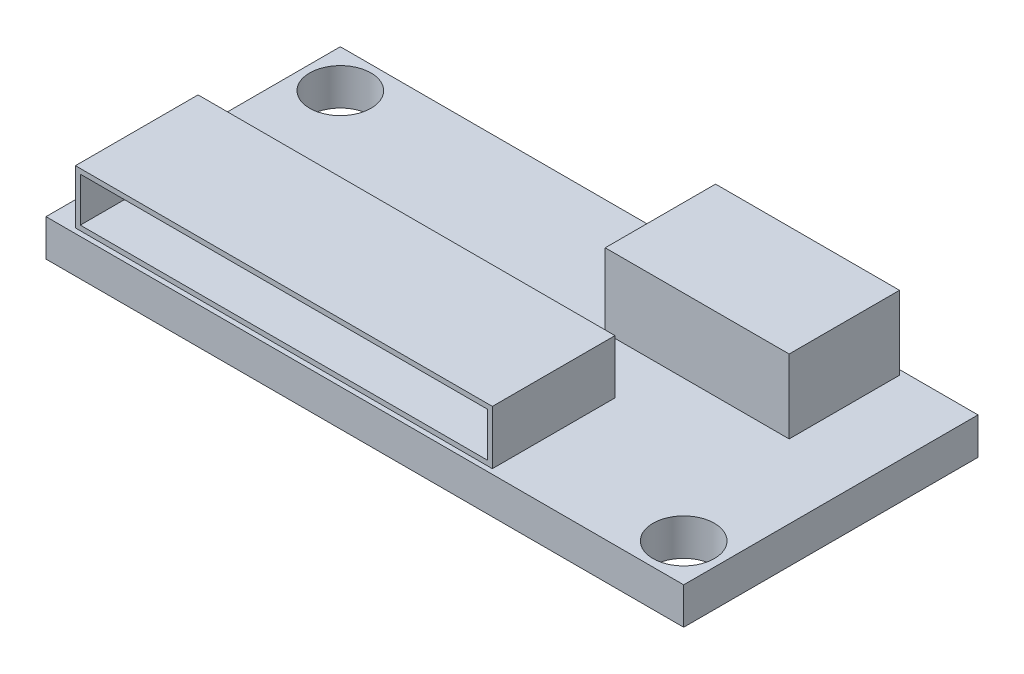
ISO-10303-21;
HEADER;
FILE_DESCRIPTION(('STEP AP214'),'2;1');
FILE_NAME('part.step','',(''),(''),'','','');
FILE_SCHEMA(('AUTOMOTIVE_DESIGN { 1 0 10303 214 1 1 1 1 }'));
ENDSEC;
DATA;
#1=APPLICATION_CONTEXT('core data for automotive mechanical design processes');
#2=APPLICATION_PROTOCOL_DEFINITION('international standard','automotive_design',2000,#1);
#3=PRODUCT_CONTEXT('',#1,'mechanical');
#4=PRODUCT('Part','Part','',(#3));
#5=PRODUCT_RELATED_PRODUCT_CATEGORY('part','',(#4));
#6=PRODUCT_DEFINITION_FORMATION('','',#4);
#7=PRODUCT_DEFINITION_CONTEXT('part definition',#1,'design');
#8=PRODUCT_DEFINITION('design','',#6,#7);
#9=PRODUCT_DEFINITION_SHAPE('','',#8);
#10=(LENGTH_UNIT() NAMED_UNIT(*) SI_UNIT(.MILLI.,.METRE.));
#11=(NAMED_UNIT(*) PLANE_ANGLE_UNIT() SI_UNIT($,.RADIAN.));
#12=(NAMED_UNIT(*) SI_UNIT($,.STERADIAN.) SOLID_ANGLE_UNIT());
#13=UNCERTAINTY_MEASURE_WITH_UNIT(LENGTH_MEASURE(1.E-05),#10,'distance_accuracy_value','');
#14=(GEOMETRIC_REPRESENTATION_CONTEXT(3) GLOBAL_UNCERTAINTY_ASSIGNED_CONTEXT((#13)) GLOBAL_UNIT_ASSIGNED_CONTEXT((#10,
#11,#12)) REPRESENTATION_CONTEXT('',''));
#15=CARTESIAN_POINT('',(0.,0.,0.));
#16=DIRECTION('',(0.,0.,1.));
#17=DIRECTION('',(1.,0.,0.));
#18=AXIS2_PLACEMENT_3D('',#15,#16,#17);
#19=CARTESIAN_POINT('',(0.,0.,0.));
#20=DIRECTION('',(0.,-1.,0.));
#21=DIRECTION('',(0.,0.,-1.));
#22=AXIS2_PLACEMENT_3D('',#19,#20,#21);
#23=PLANE('',#22);
#24=CARTESIAN_POINT('',(1.55,0.,-10.45));
#25=DIRECTION('',(0.,1.,0.));
#26=DIRECTION('',(0.,0.,1.));
#27=AXIS2_PLACEMENT_3D('',#24,#25,#26);
#28=CIRCLE('',#27,1.25);
#29=CARTESIAN_POINT('',(1.55,0.,-9.2));
#30=VERTEX_POINT('',#29);
#31=EDGE_CURVE('E363',#30,#30,#28,.T.);
#32=ORIENTED_EDGE('',*,*,#31,.T.);
#33=EDGE_LOOP('',(#32));
#34=FACE_BOUND('',#33,.T.);
#35=DIRECTION('',(0.,0.,1.));
#36=VECTOR('',#35,1.);
#37=CARTESIAN_POINT('',(0.,0.,0.));
#38=LINE('',#37,#36);
#39=CARTESIAN_POINT('',(0.,0.,-12.));
#40=VERTEX_POINT('',#39);
#41=CARTESIAN_POINT('',(0.,0.,0.));
#42=VERTEX_POINT('',#41);
#43=EDGE_CURVE('E369',#40,#42,#38,.T.);
#44=ORIENTED_EDGE('',*,*,#43,.F.);
#45=DIRECTION('',(-1.,0.,0.));
#46=VECTOR('',#45,1.);
#47=CARTESIAN_POINT('',(0.,0.,-12.));
#48=LINE('',#47,#46);
#49=CARTESIAN_POINT('',(26.,0.,-12.));
#50=VERTEX_POINT('',#49);
#51=EDGE_CURVE('E376',#50,#40,#48,.T.);
#52=ORIENTED_EDGE('',*,*,#51,.F.);
#53=DIRECTION('',(0.,0.,-1.));
#54=VECTOR('',#53,1.);
#55=CARTESIAN_POINT('',(26.,0.,0.));
#56=LINE('',#55,#54);
#57=CARTESIAN_POINT('',(26.,0.,0.));
#58=VERTEX_POINT('',#57);
#59=EDGE_CURVE('E387',#58,#50,#56,.T.);
#60=ORIENTED_EDGE('',*,*,#59,.F.);
#61=DIRECTION('',(1.,0.,0.));
#62=VECTOR('',#61,1.);
#63=CARTESIAN_POINT('',(0.,0.,0.));
#64=LINE('',#63,#62);
#65=EDGE_CURVE('E385',#42,#58,#64,.T.);
#66=ORIENTED_EDGE('',*,*,#65,.F.);
#67=EDGE_LOOP('',(#44,#52,#60,#66));
#68=FACE_BOUND('',#67,.T.);
#69=CARTESIAN_POINT('',(24.45,0.,-1.55));
#70=DIRECTION('',(0.,1.,0.));
#71=DIRECTION('',(0.,0.,1.));
#72=AXIS2_PLACEMENT_3D('',#69,#70,#71);
#73=CIRCLE('',#72,1.25);
#74=CARTESIAN_POINT('',(24.45,0.,-0.299999999999999));
#75=VERTEX_POINT('',#74);
#76=EDGE_CURVE('E359',#75,#75,#73,.T.);
#77=ORIENTED_EDGE('',*,*,#76,.T.);
#78=EDGE_LOOP('',(#77));
#79=FACE_BOUND('',#78,.T.);
#80=DIRECTION('',(1.,0.,0.));
#81=VECTOR('',#80,1.);
#82=CARTESIAN_POINT('',(6.,0.,-10.6));
#83=LINE('',#82,#81);
#84=CARTESIAN_POINT('',(6.,0.,-10.6));
#85=VERTEX_POINT('',#84);
#86=CARTESIAN_POINT('',(12.5,0.,-10.6));
#87=VERTEX_POINT('',#86);
#88=EDGE_CURVE('E815',#85,#87,#83,.T.);
#89=ORIENTED_EDGE('',*,*,#88,.F.);
#90=DIRECTION('',(0.,0.,-1.));
#91=VECTOR('',#90,1.);
#92=CARTESIAN_POINT('',(6.,0.,-6.6));
#93=LINE('',#92,#91);
#94=CARTESIAN_POINT('',(6.,0.,-6.6));
#95=VERTEX_POINT('',#94);
#96=EDGE_CURVE('E232',#95,#85,#93,.T.);
#97=ORIENTED_EDGE('',*,*,#96,.F.);
#98=DIRECTION('',(-1.,0.,0.));
#99=VECTOR('',#98,1.);
#100=CARTESIAN_POINT('',(6.,0.,-6.6));
#101=LINE('',#100,#99);
#102=CARTESIAN_POINT('',(12.5,0.,-6.6));
#103=VERTEX_POINT('',#102);
#104=EDGE_CURVE('E228',#103,#95,#101,.T.);
#105=ORIENTED_EDGE('',*,*,#104,.F.);
#106=DIRECTION('',(0.,0.,1.));
#107=VECTOR('',#106,1.);
#108=CARTESIAN_POINT('',(12.5,0.,-6.6));
#109=LINE('',#108,#107);
#110=EDGE_CURVE('E812',#87,#103,#109,.T.);
#111=ORIENTED_EDGE('',*,*,#110,.F.);
#112=EDGE_LOOP('',(#89,#97,#105,#111));
#113=FACE_BOUND('',#112,.T.);
#114=ADVANCED_FACE('F47',(#34,#68,#79,#113),#23,.T.);
#115=CARTESIAN_POINT('',(0.,1.5,0.));
#116=DIRECTION('',(0.,-1.,0.));
#117=DIRECTION('',(0.,0.,-1.));
#118=AXIS2_PLACEMENT_3D('',#115,#116,#117);
#119=PLANE('',#118);
#120=DIRECTION('',(1.,0.,0.));
#121=VECTOR('',#120,1.);
#122=CARTESIAN_POINT('',(0.,1.5,-11.8));
#123=LINE('',#122,#121);
#124=CARTESIAN_POINT('',(15.5,1.5,-11.8));
#125=VERTEX_POINT('',#124);
#126=CARTESIAN_POINT('',(23.,1.5,-11.8));
#127=VERTEX_POINT('',#126);
#128=EDGE_CURVE('E310',#125,#127,#123,.T.);
#129=ORIENTED_EDGE('',*,*,#128,.T.);
#130=DIRECTION('',(0.,0.,1.));
#131=VECTOR('',#130,1.);
#132=CARTESIAN_POINT('',(23.,1.5,0.));
#133=LINE('',#132,#131);
#134=CARTESIAN_POINT('',(23.,1.5,-7.3));
#135=VERTEX_POINT('',#134);
#136=EDGE_CURVE('E296',#127,#135,#133,.T.);
#137=ORIENTED_EDGE('',*,*,#136,.T.);
#138=DIRECTION('',(1.,0.,0.));
#139=VECTOR('',#138,1.);
#140=CARTESIAN_POINT('',(0.,1.5,-7.3));
#141=LINE('',#140,#139);
#142=CARTESIAN_POINT('',(15.5,1.5,-7.3));
#143=VERTEX_POINT('',#142);
#144=EDGE_CURVE('E301',#143,#135,#141,.T.);
#145=ORIENTED_EDGE('',*,*,#144,.F.);
#146=DIRECTION('',(0.,0.,1.));
#147=VECTOR('',#146,1.);
#148=CARTESIAN_POINT('',(15.5,1.5,0.));
#149=LINE('',#148,#147);
#150=EDGE_CURVE('E312',#125,#143,#149,.T.);
#151=ORIENTED_EDGE('',*,*,#150,.F.);
#152=EDGE_LOOP('',(#129,#137,#145,#151));
#153=FACE_BOUND('',#152,.T.);
#154=DIRECTION('',(1.,0.,0.));
#155=VECTOR('',#154,1.);
#156=CARTESIAN_POINT('',(0.,1.5,-5.2));
#157=LINE('',#156,#155);
#158=CARTESIAN_POINT('',(0.999999999999997,1.5,-5.2));
#159=VERTEX_POINT('',#158);
#160=CARTESIAN_POINT('',(18.,1.5,-5.2));
#161=VERTEX_POINT('',#160);
#162=EDGE_CURVE('E343',#159,#161,#157,.T.);
#163=ORIENTED_EDGE('',*,*,#162,.T.);
#164=DIRECTION('',(0.,0.,1.));
#165=VECTOR('',#164,1.);
#166=CARTESIAN_POINT('',(18.,1.5,0.));
#167=LINE('',#166,#165);
#168=CARTESIAN_POINT('',(18.,1.5,-0.2));
#169=VERTEX_POINT('',#168);
#170=EDGE_CURVE('E328',#161,#169,#167,.T.);
#171=ORIENTED_EDGE('',*,*,#170,.T.);
#172=DIRECTION('',(1.,0.,0.));
#173=VECTOR('',#172,1.);
#174=CARTESIAN_POINT('',(0.,1.5,-0.2));
#175=LINE('',#174,#173);
#176=CARTESIAN_POINT('',(0.999999999999997,1.5,-0.2));
#177=VERTEX_POINT('',#176);
#178=EDGE_CURVE('E333',#177,#169,#175,.T.);
#179=ORIENTED_EDGE('',*,*,#178,.F.);
#180=DIRECTION('',(0.,0.,1.));
#181=VECTOR('',#180,1.);
#182=CARTESIAN_POINT('',(0.999999999999997,1.5,0.));
#183=LINE('',#182,#181);
#184=EDGE_CURVE('E346',#159,#177,#183,.T.);
#185=ORIENTED_EDGE('',*,*,#184,.F.);
#186=EDGE_LOOP('',(#163,#171,#179,#185));
#187=FACE_BOUND('',#186,.T.);
#188=DIRECTION('',(0.,0.,1.));
#189=VECTOR('',#188,1.);
#190=CARTESIAN_POINT('',(0.,1.5,0.));
#191=LINE('',#190,#189);
#192=CARTESIAN_POINT('',(0.,1.5,-12.));
#193=VERTEX_POINT('',#192);
#194=CARTESIAN_POINT('',(0.,1.5,0.));
#195=VERTEX_POINT('',#194);
#196=EDGE_CURVE('E372',#193,#195,#191,.T.);
#197=ORIENTED_EDGE('',*,*,#196,.T.);
#198=DIRECTION('',(1.,0.,0.));
#199=VECTOR('',#198,1.);
#200=CARTESIAN_POINT('',(0.,1.5,0.));
#201=LINE('',#200,#199);
#202=CARTESIAN_POINT('',(26.,1.5,0.));
#203=VERTEX_POINT('',#202);
#204=EDGE_CURVE('E375',#195,#203,#201,.T.);
#205=ORIENTED_EDGE('',*,*,#204,.T.);
#206=DIRECTION('',(0.,0.,-1.));
#207=VECTOR('',#206,1.);
#208=CARTESIAN_POINT('',(26.,1.5,0.));
#209=LINE('',#208,#207);
#210=CARTESIAN_POINT('',(26.,1.5,-12.));
#211=VERTEX_POINT('',#210);
#212=EDGE_CURVE('E378',#203,#211,#209,.T.);
#213=ORIENTED_EDGE('',*,*,#212,.T.);
#214=DIRECTION('',(-1.,0.,0.));
#215=VECTOR('',#214,1.);
#216=CARTESIAN_POINT('',(0.,1.5,-12.));
#217=LINE('',#216,#215);
#218=EDGE_CURVE('E380',#211,#193,#217,.T.);
#219=ORIENTED_EDGE('',*,*,#218,.T.);
#220=EDGE_LOOP('',(#197,#205,#213,#219));
#221=FACE_BOUND('',#220,.T.);
#222=CARTESIAN_POINT('',(1.55,1.5,-10.45));
#223=DIRECTION('',(0.,1.,0.));
#224=DIRECTION('',(0.,0.,1.));
#225=AXIS2_PLACEMENT_3D('',#222,#223,#224);
#226=CIRCLE('',#225,1.25);
#227=CARTESIAN_POINT('',(1.55,1.5,-9.2));
#228=VERTEX_POINT('',#227);
#229=EDGE_CURVE('E366',#228,#228,#226,.T.);
#230=ORIENTED_EDGE('',*,*,#229,.F.);
#231=EDGE_LOOP('',(#230));
#232=FACE_BOUND('',#231,.T.);
#233=CARTESIAN_POINT('',(24.45,1.5,-1.55));
#234=DIRECTION('',(0.,1.,0.));
#235=DIRECTION('',(0.,0.,1.));
#236=AXIS2_PLACEMENT_3D('',#233,#234,#235);
#237=CIRCLE('',#236,1.25);
#238=CARTESIAN_POINT('',(24.45,1.5,-0.299999999999999));
#239=VERTEX_POINT('',#238);
#240=EDGE_CURVE('E360',#239,#239,#237,.T.);
#241=ORIENTED_EDGE('',*,*,#240,.F.);
#242=EDGE_LOOP('',(#241));
#243=FACE_BOUND('',#242,.T.);
#244=ADVANCED_FACE('F414',(#153,#187,#221,#232,#243),#119,.F.);
#245=CARTESIAN_POINT('',(0.,1.5,0.));
#246=DIRECTION('',(1.,0.,0.));
#247=DIRECTION('',(0.,0.,-1.));
#248=AXIS2_PLACEMENT_3D('',#245,#246,#247);
#249=PLANE('',#248);
#250=ORIENTED_EDGE('',*,*,#43,.T.);
#251=DIRECTION('',(0.,-1.,0.));
#252=VECTOR('',#251,1.);
#253=CARTESIAN_POINT('',(0.,1.5,0.));
#254=LINE('',#253,#252);
#255=EDGE_CURVE('E12',#195,#42,#254,.T.);
#256=ORIENTED_EDGE('',*,*,#255,.F.);
#257=ORIENTED_EDGE('',*,*,#196,.F.);
#258=DIRECTION('',(0.,-1.,0.));
#259=VECTOR('',#258,1.);
#260=CARTESIAN_POINT('',(0.,1.5,-12.));
#261=LINE('',#260,#259);
#262=EDGE_CURVE('E382',#193,#40,#261,.T.);
#263=ORIENTED_EDGE('',*,*,#262,.T.);
#264=EDGE_LOOP('',(#250,#256,#257,#263));
#265=FACE_BOUND('',#264,.T.);
#266=ADVANCED_FACE('F49',(#265),#249,.F.);
#267=CARTESIAN_POINT('',(0.,1.5,0.));
#268=DIRECTION('',(0.,0.,-1.));
#269=DIRECTION('',(-1.,0.,0.));
#270=AXIS2_PLACEMENT_3D('',#267,#268,#269);
#271=PLANE('',#270);
#272=ORIENTED_EDGE('',*,*,#65,.T.);
#273=DIRECTION('',(0.,-1.,0.));
#274=VECTOR('',#273,1.);
#275=CARTESIAN_POINT('',(26.,1.5,0.));
#276=LINE('',#275,#274);
#277=EDGE_CURVE('E55',#203,#58,#276,.T.);
#278=ORIENTED_EDGE('',*,*,#277,.F.);
#279=ORIENTED_EDGE('',*,*,#204,.F.);
#280=ORIENTED_EDGE('',*,*,#255,.T.);
#281=EDGE_LOOP('',(#272,#278,#279,#280));
#282=FACE_BOUND('',#281,.T.);
#283=ADVANCED_FACE('F416',(#282),#271,.F.);
#284=CARTESIAN_POINT('',(26.,1.5,0.));
#285=DIRECTION('',(-1.,0.,0.));
#286=DIRECTION('',(0.,0.,1.));
#287=AXIS2_PLACEMENT_3D('',#284,#285,#286);
#288=PLANE('',#287);
#289=ORIENTED_EDGE('',*,*,#59,.T.);
#290=DIRECTION('',(0.,-1.,0.));
#291=VECTOR('',#290,1.);
#292=CARTESIAN_POINT('',(26.,1.5,-12.));
#293=LINE('',#292,#291);
#294=EDGE_CURVE('E392',#211,#50,#293,.T.);
#295=ORIENTED_EDGE('',*,*,#294,.F.);
#296=ORIENTED_EDGE('',*,*,#212,.F.);
#297=ORIENTED_EDGE('',*,*,#277,.T.);
#298=EDGE_LOOP('',(#289,#295,#296,#297));
#299=FACE_BOUND('',#298,.T.);
#300=ADVANCED_FACE('F399',(#299),#288,.F.);
#301=CARTESIAN_POINT('',(0.,1.5,-12.));
#302=DIRECTION('',(0.,0.,1.));
#303=DIRECTION('',(1.,0.,0.));
#304=AXIS2_PLACEMENT_3D('',#301,#302,#303);
#305=PLANE('',#304);
#306=ORIENTED_EDGE('',*,*,#51,.T.);
#307=ORIENTED_EDGE('',*,*,#262,.F.);
#308=ORIENTED_EDGE('',*,*,#218,.F.);
#309=ORIENTED_EDGE('',*,*,#294,.T.);
#310=EDGE_LOOP('',(#306,#307,#308,#309));
#311=FACE_BOUND('',#310,.T.);
#312=ADVANCED_FACE('F408',(#311),#305,.F.);
#313=CARTESIAN_POINT('',(1.55,1.5,-10.45));
#314=DIRECTION('',(0.,-1.,0.));
#315=DIRECTION('',(0.,0.,-1.));
#316=AXIS2_PLACEMENT_3D('',#313,#314,#315);
#317=CYLINDRICAL_SURFACE('',#316,1.25);
#318=ORIENTED_EDGE('',*,*,#229,.T.);
#319=EDGE_LOOP('',(#318));
#320=FACE_BOUND('',#319,.T.);
#321=ORIENTED_EDGE('',*,*,#31,.F.);
#322=EDGE_LOOP('',(#321));
#323=FACE_BOUND('',#322,.T.);
#324=ADVANCED_FACE('F436',(#320,#323),#317,.F.);
#325=CARTESIAN_POINT('',(24.45,1.5,-1.55));
#326=DIRECTION('',(0.,-1.,0.));
#327=DIRECTION('',(0.,0.,-1.));
#328=AXIS2_PLACEMENT_3D('',#325,#326,#327);
#329=CYLINDRICAL_SURFACE('',#328,1.25);
#330=ORIENTED_EDGE('',*,*,#240,.T.);
#331=EDGE_LOOP('',(#330));
#332=FACE_BOUND('',#331,.T.);
#333=ORIENTED_EDGE('',*,*,#76,.F.);
#334=EDGE_LOOP('',(#333));
#335=FACE_BOUND('',#334,.T.);
#336=ADVANCED_FACE('F440',(#332,#335),#329,.F.);
#337=CARTESIAN_POINT('',(18.,3.7,0.));
#338=DIRECTION('',(1.,0.,0.));
#339=DIRECTION('',(0.,0.,-1.));
#340=AXIS2_PLACEMENT_3D('',#337,#338,#339);
#341=PLANE('',#340);
#342=ORIENTED_EDGE('',*,*,#170,.F.);
#343=DIRECTION('',(0.,-1.,0.));
#344=VECTOR('',#343,1.);
#345=CARTESIAN_POINT('',(18.,3.7,-5.2));
#346=LINE('',#345,#344);
#347=CARTESIAN_POINT('',(18.,3.7,-5.2));
#348=VERTEX_POINT('',#347);
#349=EDGE_CURVE('E356',#348,#161,#346,.T.);
#350=ORIENTED_EDGE('',*,*,#349,.F.);
#351=DIRECTION('',(0.,0.,1.));
#352=VECTOR('',#351,1.);
#353=CARTESIAN_POINT('',(18.,3.7,0.));
#354=LINE('',#353,#352);
#355=CARTESIAN_POINT('',(18.,3.7,-0.2));
#356=VERTEX_POINT('',#355);
#357=EDGE_CURVE('E329',#348,#356,#354,.T.);
#358=ORIENTED_EDGE('',*,*,#357,.T.);
#359=DIRECTION('',(0.,-1.,0.));
#360=VECTOR('',#359,1.);
#361=CARTESIAN_POINT('',(18.,3.7,-0.2));
#362=LINE('',#361,#360);
#363=EDGE_CURVE('E340',#356,#169,#362,.T.);
#364=ORIENTED_EDGE('',*,*,#363,.T.);
#365=EDGE_LOOP('',(#342,#350,#358,#364));
#366=FACE_BOUND('',#365,.T.);
#367=ADVANCED_FACE('F445',(#366),#341,.T.);
#368=CARTESIAN_POINT('',(0.,3.7,-5.2));
#369=DIRECTION('',(0.,0.,-1.));
#370=DIRECTION('',(-1.,0.,0.));
#371=AXIS2_PLACEMENT_3D('',#368,#369,#370);
#372=PLANE('',#371);
#373=ORIENTED_EDGE('',*,*,#162,.F.);
#374=DIRECTION('',(0.,-1.,0.));
#375=VECTOR('',#374,1.);
#376=CARTESIAN_POINT('',(0.999999999999997,3.7,-5.2));
#377=LINE('',#376,#375);
#378=CARTESIAN_POINT('',(0.999999999999997,3.7,-5.2));
#379=VERTEX_POINT('',#378);
#380=EDGE_CURVE('E354',#379,#159,#377,.T.);
#381=ORIENTED_EDGE('',*,*,#380,.F.);
#382=DIRECTION('',(1.,0.,0.));
#383=VECTOR('',#382,1.);
#384=CARTESIAN_POINT('',(0.,3.7,-5.2));
#385=LINE('',#384,#383);
#386=EDGE_CURVE('E332',#379,#348,#385,.T.);
#387=ORIENTED_EDGE('',*,*,#386,.T.);
#388=ORIENTED_EDGE('',*,*,#349,.T.);
#389=EDGE_LOOP('',(#373,#381,#387,#388));
#390=FACE_BOUND('',#389,.T.);
#391=ADVANCED_FACE('F452',(#390),#372,.T.);
#392=CARTESIAN_POINT('',(0.999999999999997,3.7,0.));
#393=DIRECTION('',(1.,0.,0.));
#394=DIRECTION('',(0.,0.,-1.));
#395=AXIS2_PLACEMENT_3D('',#392,#393,#394);
#396=PLANE('',#395);
#397=ORIENTED_EDGE('',*,*,#184,.T.);
#398=DIRECTION('',(0.,-1.,0.));
#399=VECTOR('',#398,1.);
#400=CARTESIAN_POINT('',(0.999999999999997,3.7,-0.2));
#401=LINE('',#400,#399);
#402=CARTESIAN_POINT('',(0.999999999999997,3.7,-0.2));
#403=VERTEX_POINT('',#402);
#404=EDGE_CURVE('E351',#403,#177,#401,.T.);
#405=ORIENTED_EDGE('',*,*,#404,.F.);
#406=DIRECTION('',(0.,0.,1.));
#407=VECTOR('',#406,1.);
#408=CARTESIAN_POINT('',(0.999999999999997,3.7,0.));
#409=LINE('',#408,#407);
#410=EDGE_CURVE('E336',#379,#403,#409,.T.);
#411=ORIENTED_EDGE('',*,*,#410,.F.);
#412=ORIENTED_EDGE('',*,*,#380,.T.);
#413=EDGE_LOOP('',(#397,#405,#411,#412));
#414=FACE_BOUND('',#413,.T.);
#415=ADVANCED_FACE('F456',(#414),#396,.F.);
#416=CARTESIAN_POINT('',(0.,3.7,-0.2));
#417=DIRECTION('',(0.,0.,-1.));
#418=DIRECTION('',(-1.,0.,0.));
#419=AXIS2_PLACEMENT_3D('',#416,#417,#418);
#420=PLANE('',#419);
#421=DIRECTION('',(0.,1.,0.));
#422=VECTOR('',#421,1.);
#423=CARTESIAN_POINT('',(17.8,1.7,-0.2));
#424=LINE('',#423,#422);
#425=CARTESIAN_POINT('',(17.8,1.7,-0.2));
#426=VERTEX_POINT('',#425);
#427=CARTESIAN_POINT('',(17.8,3.5,-0.2));
#428=VERTEX_POINT('',#427);
#429=EDGE_CURVE('E244',#426,#428,#424,.T.);
#430=ORIENTED_EDGE('',*,*,#429,.F.);
#431=DIRECTION('',(1.,0.,0.));
#432=VECTOR('',#431,1.);
#433=CARTESIAN_POINT('',(1.2,1.7,-0.2));
#434=LINE('',#433,#432);
#435=CARTESIAN_POINT('',(1.2,1.7,-0.2));
#436=VERTEX_POINT('',#435);
#437=EDGE_CURVE('E237',#436,#426,#434,.T.);
#438=ORIENTED_EDGE('',*,*,#437,.F.);
#439=DIRECTION('',(0.,-1.,0.));
#440=VECTOR('',#439,1.);
#441=CARTESIAN_POINT('',(1.2,3.5,-0.2));
#442=LINE('',#441,#440);
#443=CARTESIAN_POINT('',(1.2,3.5,-0.2));
#444=VERTEX_POINT('',#443);
#445=EDGE_CURVE('E234',#444,#436,#442,.T.);
#446=ORIENTED_EDGE('',*,*,#445,.F.);
#447=DIRECTION('',(-1.,0.,0.));
#448=VECTOR('',#447,1.);
#449=CARTESIAN_POINT('',(17.8,3.5,-0.2));
#450=LINE('',#449,#448);
#451=EDGE_CURVE('E70',#428,#444,#450,.T.);
#452=ORIENTED_EDGE('',*,*,#451,.F.);
#453=EDGE_LOOP('',(#430,#438,#446,#452));
#454=FACE_BOUND('',#453,.T.);
#455=ORIENTED_EDGE('',*,*,#178,.T.);
#456=ORIENTED_EDGE('',*,*,#363,.F.);
#457=DIRECTION('',(1.,0.,0.));
#458=VECTOR('',#457,1.);
#459=CARTESIAN_POINT('',(0.,3.7,-0.2));
#460=LINE('',#459,#458);
#461=EDGE_CURVE('E338',#403,#356,#460,.T.);
#462=ORIENTED_EDGE('',*,*,#461,.F.);
#463=ORIENTED_EDGE('',*,*,#404,.T.);
#464=EDGE_LOOP('',(#455,#456,#462,#463));
#465=FACE_BOUND('',#464,.T.);
#466=ADVANCED_FACE('F460',(#454,#465),#420,.F.);
#467=CARTESIAN_POINT('',(0.,3.7,0.));
#468=DIRECTION('',(0.,1.,0.));
#469=DIRECTION('',(0.,0.,1.));
#470=AXIS2_PLACEMENT_3D('',#467,#468,#469);
#471=PLANE('',#470);
#472=ORIENTED_EDGE('',*,*,#357,.F.);
#473=ORIENTED_EDGE('',*,*,#386,.F.);
#474=ORIENTED_EDGE('',*,*,#410,.T.);
#475=ORIENTED_EDGE('',*,*,#461,.T.);
#476=EDGE_LOOP('',(#472,#473,#474,#475));
#477=FACE_BOUND('',#476,.T.);
#478=ADVANCED_FACE('F464',(#477),#471,.T.);
#479=CARTESIAN_POINT('',(23.,4.5,0.));
#480=DIRECTION('',(1.,0.,0.));
#481=DIRECTION('',(0.,0.,-1.));
#482=AXIS2_PLACEMENT_3D('',#479,#480,#481);
#483=PLANE('',#482);
#484=ORIENTED_EDGE('',*,*,#136,.F.);
#485=DIRECTION('',(0.,-1.,0.));
#486=VECTOR('',#485,1.);
#487=CARTESIAN_POINT('',(23.,4.5,-11.8));
#488=LINE('',#487,#486);
#489=CARTESIAN_POINT('',(23.,4.5,-11.8));
#490=VERTEX_POINT('',#489);
#491=EDGE_CURVE('E325',#490,#127,#488,.T.);
#492=ORIENTED_EDGE('',*,*,#491,.F.);
#493=DIRECTION('',(0.,0.,1.));
#494=VECTOR('',#493,1.);
#495=CARTESIAN_POINT('',(23.,4.5,0.));
#496=LINE('',#495,#494);
#497=CARTESIAN_POINT('',(23.,4.5,-7.3));
#498=VERTEX_POINT('',#497);
#499=EDGE_CURVE('E297',#490,#498,#496,.T.);
#500=ORIENTED_EDGE('',*,*,#499,.T.);
#501=DIRECTION('',(0.,-1.,0.));
#502=VECTOR('',#501,1.);
#503=CARTESIAN_POINT('',(23.,4.5,-7.3));
#504=LINE('',#503,#502);
#505=EDGE_CURVE('E308',#498,#135,#504,.T.);
#506=ORIENTED_EDGE('',*,*,#505,.T.);
#507=EDGE_LOOP('',(#484,#492,#500,#506));
#508=FACE_BOUND('',#507,.T.);
#509=ADVANCED_FACE('F468',(#508),#483,.T.);
#510=CARTESIAN_POINT('',(0.,4.5,-11.8));
#511=DIRECTION('',(0.,0.,-1.));
#512=DIRECTION('',(-1.,0.,0.));
#513=AXIS2_PLACEMENT_3D('',#510,#511,#512);
#514=PLANE('',#513);
#515=DIRECTION('',(0.,-1.,0.));
#516=VECTOR('',#515,1.);
#517=CARTESIAN_POINT('',(22.8,4.3,-11.8));
#518=LINE('',#517,#516);
#519=CARTESIAN_POINT('',(22.8,4.3,-11.8));
#520=VERTEX_POINT('',#519);
#521=CARTESIAN_POINT('',(22.8,1.7,-11.8));
#522=VERTEX_POINT('',#521);
#523=EDGE_CURVE('E268',#520,#522,#518,.T.);
#524=ORIENTED_EDGE('',*,*,#523,.F.);
#525=DIRECTION('',(1.,0.,0.));
#526=VECTOR('',#525,1.);
#527=CARTESIAN_POINT('',(15.7,4.3,-11.8));
#528=LINE('',#527,#526);
#529=CARTESIAN_POINT('',(15.7,4.3,-11.8));
#530=VERTEX_POINT('',#529);
#531=EDGE_CURVE('E284',#530,#520,#528,.T.);
#532=ORIENTED_EDGE('',*,*,#531,.F.);
#533=DIRECTION('',(0.,1.,0.));
#534=VECTOR('',#533,1.);
#535=CARTESIAN_POINT('',(15.7,1.7,-11.8));
#536=LINE('',#535,#534);
#537=CARTESIAN_POINT('',(15.7,1.7,-11.8));
#538=VERTEX_POINT('',#537);
#539=EDGE_CURVE('E281',#538,#530,#536,.T.);
#540=ORIENTED_EDGE('',*,*,#539,.F.);
#541=DIRECTION('',(-1.,0.,0.));
#542=VECTOR('',#541,1.);
#543=CARTESIAN_POINT('',(22.8,1.7,-11.8));
#544=LINE('',#543,#542);
#545=EDGE_CURVE('E278',#522,#538,#544,.T.);
#546=ORIENTED_EDGE('',*,*,#545,.F.);
#547=EDGE_LOOP('',(#524,#532,#540,#546));
#548=FACE_BOUND('',#547,.T.);
#549=ORIENTED_EDGE('',*,*,#128,.F.);
#550=DIRECTION('',(0.,-1.,0.));
#551=VECTOR('',#550,1.);
#552=CARTESIAN_POINT('',(15.5,4.5,-11.8));
#553=LINE('',#552,#551);
#554=CARTESIAN_POINT('',(15.5,4.5,-11.8));
#555=VERTEX_POINT('',#554);
#556=EDGE_CURVE('E322',#555,#125,#553,.T.);
#557=ORIENTED_EDGE('',*,*,#556,.F.);
#558=DIRECTION('',(1.,0.,0.));
#559=VECTOR('',#558,1.);
#560=CARTESIAN_POINT('',(0.,4.5,-11.8));
#561=LINE('',#560,#559);
#562=EDGE_CURVE('E300',#555,#490,#561,.T.);
#563=ORIENTED_EDGE('',*,*,#562,.T.);
#564=ORIENTED_EDGE('',*,*,#491,.T.);
#565=EDGE_LOOP('',(#549,#557,#563,#564));
#566=FACE_BOUND('',#565,.T.);
#567=ADVANCED_FACE('F472',(#548,#566),#514,.T.);
#568=CARTESIAN_POINT('',(15.5,4.5,0.));
#569=DIRECTION('',(1.,0.,0.));
#570=DIRECTION('',(0.,0.,-1.));
#571=AXIS2_PLACEMENT_3D('',#568,#569,#570);
#572=PLANE('',#571);
#573=ORIENTED_EDGE('',*,*,#150,.T.);
#574=DIRECTION('',(0.,-1.,0.));
#575=VECTOR('',#574,1.);
#576=CARTESIAN_POINT('',(15.5,4.5,-7.3));
#577=LINE('',#576,#575);
#578=CARTESIAN_POINT('',(15.5,4.5,-7.3));
#579=VERTEX_POINT('',#578);
#580=EDGE_CURVE('E319',#579,#143,#577,.T.);
#581=ORIENTED_EDGE('',*,*,#580,.F.);
#582=DIRECTION('',(0.,0.,1.));
#583=VECTOR('',#582,1.);
#584=CARTESIAN_POINT('',(15.5,4.5,0.));
#585=LINE('',#584,#583);
#586=EDGE_CURVE('E304',#555,#579,#585,.T.);
#587=ORIENTED_EDGE('',*,*,#586,.F.);
#588=ORIENTED_EDGE('',*,*,#556,.T.);
#589=EDGE_LOOP('',(#573,#581,#587,#588));
#590=FACE_BOUND('',#589,.T.);
#591=ADVANCED_FACE('F476',(#590),#572,.F.);
#592=CARTESIAN_POINT('',(0.,4.5,-7.3));
#593=DIRECTION('',(0.,0.,-1.));
#594=DIRECTION('',(-1.,0.,0.));
#595=AXIS2_PLACEMENT_3D('',#592,#593,#594);
#596=PLANE('',#595);
#597=ORIENTED_EDGE('',*,*,#144,.T.);
#598=ORIENTED_EDGE('',*,*,#505,.F.);
#599=DIRECTION('',(1.,0.,0.));
#600=VECTOR('',#599,1.);
#601=CARTESIAN_POINT('',(0.,4.5,-7.3));
#602=LINE('',#601,#600);
#603=EDGE_CURVE('E306',#579,#498,#602,.T.);
#604=ORIENTED_EDGE('',*,*,#603,.F.);
#605=ORIENTED_EDGE('',*,*,#580,.T.);
#606=EDGE_LOOP('',(#597,#598,#604,#605));
#607=FACE_BOUND('',#606,.T.);
#608=ADVANCED_FACE('F480',(#607),#596,.F.);
#609=CARTESIAN_POINT('',(0.,4.5,0.));
#610=DIRECTION('',(0.,1.,0.));
#611=DIRECTION('',(0.,0.,1.));
#612=AXIS2_PLACEMENT_3D('',#609,#610,#611);
#613=PLANE('',#612);
#614=ORIENTED_EDGE('',*,*,#499,.F.);
#615=ORIENTED_EDGE('',*,*,#562,.F.);
#616=ORIENTED_EDGE('',*,*,#586,.T.);
#617=ORIENTED_EDGE('',*,*,#603,.T.);
#618=EDGE_LOOP('',(#614,#615,#616,#617));
#619=FACE_BOUND('',#618,.T.);
#620=ADVANCED_FACE('F484',(#619),#613,.T.);
#621=CARTESIAN_POINT('',(22.8,4.3,0.261084578286374));
#622=DIRECTION('',(1.,0.,0.));
#623=DIRECTION('',(0.,0.,-1.));
#624=AXIS2_PLACEMENT_3D('',#621,#622,#623);
#625=PLANE('',#624);
#626=DIRECTION('',(0.,1.,0.));
#627=VECTOR('',#626,1.);
#628=CARTESIAN_POINT('',(22.8,4.3,-7.5));
#629=LINE('',#628,#627);
#630=CARTESIAN_POINT('',(22.8,1.7,-7.5));
#631=VERTEX_POINT('',#630);
#632=CARTESIAN_POINT('',(22.8,4.3,-7.5));
#633=VERTEX_POINT('',#632);
#634=EDGE_CURVE('E274',#631,#633,#629,.T.);
#635=ORIENTED_EDGE('',*,*,#634,.T.);
#636=DIRECTION('',(0.,0.,-1.));
#637=VECTOR('',#636,1.);
#638=CARTESIAN_POINT('',(22.8,4.3,0.261084578286374));
#639=LINE('',#638,#637);
#640=EDGE_CURVE('E272',#633,#520,#639,.T.);
#641=ORIENTED_EDGE('',*,*,#640,.T.);
#642=ORIENTED_EDGE('',*,*,#523,.T.);
#643=DIRECTION('',(0.,0.,-1.));
#644=VECTOR('',#643,1.);
#645=CARTESIAN_POINT('',(22.8,1.7,0.261084578286374));
#646=LINE('',#645,#644);
#647=EDGE_CURVE('E287',#631,#522,#646,.T.);
#648=ORIENTED_EDGE('',*,*,#647,.F.);
#649=EDGE_LOOP('',(#635,#641,#642,#648));
#650=FACE_BOUND('',#649,.T.);
#651=ADVANCED_FACE('F488',(#650),#625,.F.);
#652=CARTESIAN_POINT('',(15.7,4.3,0.261084578286374));
#653=DIRECTION('',(0.,1.,0.));
#654=DIRECTION('',(0.,0.,1.));
#655=AXIS2_PLACEMENT_3D('',#652,#653,#654);
#656=PLANE('',#655);
#657=DIRECTION('',(-1.,0.,0.));
#658=VECTOR('',#657,1.);
#659=CARTESIAN_POINT('',(15.7,4.3,-7.5));
#660=LINE('',#659,#658);
#661=CARTESIAN_POINT('',(15.7,4.3,-7.5));
#662=VERTEX_POINT('',#661);
#663=EDGE_CURVE('E271',#633,#662,#660,.T.);
#664=ORIENTED_EDGE('',*,*,#663,.T.);
#665=DIRECTION('',(0.,0.,-1.));
#666=VECTOR('',#665,1.);
#667=CARTESIAN_POINT('',(15.7,4.3,0.261084578286374));
#668=LINE('',#667,#666);
#669=EDGE_CURVE('E289',#662,#530,#668,.T.);
#670=ORIENTED_EDGE('',*,*,#669,.T.);
#671=ORIENTED_EDGE('',*,*,#531,.T.);
#672=ORIENTED_EDGE('',*,*,#640,.F.);
#673=EDGE_LOOP('',(#664,#670,#671,#672));
#674=FACE_BOUND('',#673,.T.);
#675=ADVANCED_FACE('F492',(#674),#656,.F.);
#676=CARTESIAN_POINT('',(15.7,1.7,0.261084578286374));
#677=DIRECTION('',(-1.,0.,0.));
#678=DIRECTION('',(0.,0.,1.));
#679=AXIS2_PLACEMENT_3D('',#676,#677,#678);
#680=PLANE('',#679);
#681=DIRECTION('',(0.,-1.,0.));
#682=VECTOR('',#681,1.);
#683=CARTESIAN_POINT('',(15.7,1.7,-7.5));
#684=LINE('',#683,#682);
#685=CARTESIAN_POINT('',(15.7,1.7,-7.5));
#686=VERTEX_POINT('',#685);
#687=EDGE_CURVE('E269',#662,#686,#684,.T.);
#688=ORIENTED_EDGE('',*,*,#687,.T.);
#689=DIRECTION('',(0.,0.,-1.));
#690=VECTOR('',#689,1.);
#691=CARTESIAN_POINT('',(15.7,1.7,0.261084578286374));
#692=LINE('',#691,#690);
#693=EDGE_CURVE('E291',#686,#538,#692,.T.);
#694=ORIENTED_EDGE('',*,*,#693,.T.);
#695=ORIENTED_EDGE('',*,*,#539,.T.);
#696=ORIENTED_EDGE('',*,*,#669,.F.);
#697=EDGE_LOOP('',(#688,#694,#695,#696));
#698=FACE_BOUND('',#697,.T.);
#699=ADVANCED_FACE('F498',(#698),#680,.F.);
#700=CARTESIAN_POINT('',(22.8,1.7,0.261084578286374));
#701=DIRECTION('',(0.,-1.,0.));
#702=DIRECTION('',(0.,0.,-1.));
#703=AXIS2_PLACEMENT_3D('',#700,#701,#702);
#704=PLANE('',#703);
#705=DIRECTION('',(1.,0.,0.));
#706=VECTOR('',#705,1.);
#707=CARTESIAN_POINT('',(22.8,1.7,-7.5));
#708=LINE('',#707,#706);
#709=EDGE_CURVE('E276',#686,#631,#708,.T.);
#710=ORIENTED_EDGE('',*,*,#709,.T.);
#711=ORIENTED_EDGE('',*,*,#647,.T.);
#712=ORIENTED_EDGE('',*,*,#545,.T.);
#713=ORIENTED_EDGE('',*,*,#693,.F.);
#714=EDGE_LOOP('',(#710,#711,#712,#713));
#715=FACE_BOUND('',#714,.T.);
#716=ADVANCED_FACE('F494',(#715),#704,.F.);
#717=CARTESIAN_POINT('',(0.,4.5,-7.5));
#718=DIRECTION('',(0.,0.,-1.));
#719=DIRECTION('',(-1.,0.,0.));
#720=AXIS2_PLACEMENT_3D('',#717,#718,#719);
#721=PLANE('',#720);
#722=ORIENTED_EDGE('',*,*,#634,.F.);
#723=ORIENTED_EDGE('',*,*,#709,.F.);
#724=ORIENTED_EDGE('',*,*,#687,.F.);
#725=ORIENTED_EDGE('',*,*,#663,.F.);
#726=EDGE_LOOP('',(#722,#723,#724,#725));
#727=FACE_BOUND('',#726,.T.);
#728=ADVANCED_FACE('F497',(#727),#721,.T.);
#729=CARTESIAN_POINT('',(0.,3.7,-5.));
#730=DIRECTION('',(0.,0.,-1.));
#731=DIRECTION('',(-1.,0.,0.));
#732=AXIS2_PLACEMENT_3D('',#729,#730,#731);
#733=PLANE('',#732);
#734=DIRECTION('',(0.,-1.,0.));
#735=VECTOR('',#734,1.);
#736=CARTESIAN_POINT('',(1.2,3.5,-5.));
#737=LINE('',#736,#735);
#738=CARTESIAN_POINT('',(1.2,3.5,-5.));
#739=VERTEX_POINT('',#738);
#740=CARTESIAN_POINT('',(1.2,1.7,-5.));
#741=VERTEX_POINT('',#740);
#742=EDGE_CURVE('E252',#739,#741,#737,.T.);
#743=ORIENTED_EDGE('',*,*,#742,.T.);
#744=DIRECTION('',(1.,0.,0.));
#745=VECTOR('',#744,1.);
#746=CARTESIAN_POINT('',(1.2,1.7,-5.));
#747=LINE('',#746,#745);
#748=CARTESIAN_POINT('',(17.8,1.7,-5.00000000000001));
#749=VERTEX_POINT('',#748);
#750=EDGE_CURVE('E243',#741,#749,#747,.T.);
#751=ORIENTED_EDGE('',*,*,#750,.T.);
#752=DIRECTION('',(0.,1.,0.));
#753=VECTOR('',#752,1.);
#754=CARTESIAN_POINT('',(17.8,1.7,-5.));
#755=LINE('',#754,#753);
#756=CARTESIAN_POINT('',(17.8,3.5,-5.));
#757=VERTEX_POINT('',#756);
#758=EDGE_CURVE('E261',#749,#757,#755,.T.);
#759=ORIENTED_EDGE('',*,*,#758,.T.);
#760=DIRECTION('',(-1.,0.,0.));
#761=VECTOR('',#760,1.);
#762=CARTESIAN_POINT('',(17.8,3.5,-5.));
#763=LINE('',#762,#761);
#764=EDGE_CURVE('E257',#757,#739,#763,.T.);
#765=ORIENTED_EDGE('',*,*,#764,.T.);
#766=EDGE_LOOP('',(#743,#751,#759,#765));
#767=FACE_BOUND('',#766,.T.);
#768=ADVANCED_FACE('F508',(#767),#733,.F.);
#769=CARTESIAN_POINT('',(1.2,1.7,-21.8973051717934));
#770=DIRECTION('',(0.,-1.,0.));
#771=DIRECTION('',(0.,0.,-1.));
#772=AXIS2_PLACEMENT_3D('',#769,#770,#771);
#773=PLANE('',#772);
#774=DIRECTION('',(0.,0.,1.));
#775=VECTOR('',#774,1.);
#776=CARTESIAN_POINT('',(1.2,1.7,-21.8973051717934));
#777=LINE('',#776,#775);
#778=EDGE_CURVE('E255',#741,#436,#777,.T.);
#779=ORIENTED_EDGE('',*,*,#778,.T.);
#780=ORIENTED_EDGE('',*,*,#437,.T.);
#781=DIRECTION('',(0.,0.,1.));
#782=VECTOR('',#781,1.);
#783=CARTESIAN_POINT('',(17.8,1.7,-21.8973051717934));
#784=LINE('',#783,#782);
#785=EDGE_CURVE('E251',#749,#426,#784,.T.);
#786=ORIENTED_EDGE('',*,*,#785,.F.);
#787=ORIENTED_EDGE('',*,*,#750,.F.);
#788=EDGE_LOOP('',(#779,#780,#786,#787));
#789=FACE_BOUND('',#788,.T.);
#790=ADVANCED_FACE('F512',(#789),#773,.F.);
#791=CARTESIAN_POINT('',(17.8,1.7,-21.8973051717934));
#792=DIRECTION('',(1.,0.,0.));
#793=DIRECTION('',(0.,0.,-1.));
#794=AXIS2_PLACEMENT_3D('',#791,#792,#793);
#795=PLANE('',#794);
#796=ORIENTED_EDGE('',*,*,#785,.T.);
#797=ORIENTED_EDGE('',*,*,#429,.T.);
#798=DIRECTION('',(0.,0.,1.));
#799=VECTOR('',#798,1.);
#800=CARTESIAN_POINT('',(17.8,3.5,-21.8973051717934));
#801=LINE('',#800,#799);
#802=EDGE_CURVE('E260',#757,#428,#801,.T.);
#803=ORIENTED_EDGE('',*,*,#802,.F.);
#804=ORIENTED_EDGE('',*,*,#758,.F.);
#805=EDGE_LOOP('',(#796,#797,#803,#804));
#806=FACE_BOUND('',#805,.T.);
#807=ADVANCED_FACE('F516',(#806),#795,.F.);
#808=CARTESIAN_POINT('',(17.8,3.5,-21.8973051717934));
#809=DIRECTION('',(0.,1.,0.));
#810=DIRECTION('',(0.,0.,1.));
#811=AXIS2_PLACEMENT_3D('',#808,#809,#810);
#812=PLANE('',#811);
#813=ORIENTED_EDGE('',*,*,#802,.T.);
#814=ORIENTED_EDGE('',*,*,#451,.T.);
#815=DIRECTION('',(0.,0.,1.));
#816=VECTOR('',#815,1.);
#817=CARTESIAN_POINT('',(1.2,3.5,-21.8973051717934));
#818=LINE('',#817,#816);
#819=EDGE_CURVE('E256',#739,#444,#818,.T.);
#820=ORIENTED_EDGE('',*,*,#819,.F.);
#821=ORIENTED_EDGE('',*,*,#764,.F.);
#822=EDGE_LOOP('',(#813,#814,#820,#821));
#823=FACE_BOUND('',#822,.T.);
#824=ADVANCED_FACE('F520',(#823),#812,.F.);
#825=CARTESIAN_POINT('',(1.2,3.5,-21.8973051717934));
#826=DIRECTION('',(-1.,0.,0.));
#827=DIRECTION('',(0.,0.,1.));
#828=AXIS2_PLACEMENT_3D('',#825,#826,#827);
#829=PLANE('',#828);
#830=ORIENTED_EDGE('',*,*,#819,.T.);
#831=ORIENTED_EDGE('',*,*,#445,.T.);
#832=ORIENTED_EDGE('',*,*,#778,.F.);
#833=ORIENTED_EDGE('',*,*,#742,.F.);
#834=EDGE_LOOP('',(#830,#831,#832,#833));
#835=FACE_BOUND('',#834,.T.);
#836=ADVANCED_FACE('F524',(#835),#829,.F.);
#837=CARTESIAN_POINT('',(6.,-0.8,-6.6));
#838=DIRECTION('',(1.,0.,0.));
#839=DIRECTION('',(0.,0.,-1.));
#840=AXIS2_PLACEMENT_3D('',#837,#838,#839);
#841=PLANE('',#840);
#842=ORIENTED_EDGE('',*,*,#96,.T.);
#843=DIRECTION('',(0.,1.,0.));
#844=VECTOR('',#843,1.);
#845=CARTESIAN_POINT('',(6.,-0.8,-10.6));
#846=LINE('',#845,#844);
#847=CARTESIAN_POINT('',(6.,-0.8,-10.6));
#848=VERTEX_POINT('',#847);
#849=EDGE_CURVE('E213',#848,#85,#846,.T.);
#850=ORIENTED_EDGE('',*,*,#849,.F.);
#851=DIRECTION('',(0.,0.,-1.));
#852=VECTOR('',#851,1.);
#853=CARTESIAN_POINT('',(6.,-0.8,-6.6));
#854=LINE('',#853,#852);
#855=CARTESIAN_POINT('',(6.,-0.8,-6.6));
#856=VERTEX_POINT('',#855);
#857=EDGE_CURVE('E220',#856,#848,#854,.T.);
#858=ORIENTED_EDGE('',*,*,#857,.F.);
#859=DIRECTION('',(0.,1.,0.));
#860=VECTOR('',#859,1.);
#861=CARTESIAN_POINT('',(6.,-0.8,-6.6));
#862=LINE('',#861,#860);
#863=EDGE_CURVE('E809',#856,#95,#862,.T.);
#864=ORIENTED_EDGE('',*,*,#863,.T.);
#865=EDGE_LOOP('',(#842,#850,#858,#864));
#866=FACE_BOUND('',#865,.T.);
#867=ADVANCED_FACE('F230',(#866),#841,.F.);
#868=CARTESIAN_POINT('',(6.,-0.8,-10.6));
#869=DIRECTION('',(0.,0.,1.));
#870=DIRECTION('',(1.,0.,0.));
#871=AXIS2_PLACEMENT_3D('',#868,#869,#870);
#872=PLANE('',#871);
#873=ORIENTED_EDGE('',*,*,#88,.T.);
#874=DIRECTION('',(0.,1.,0.));
#875=VECTOR('',#874,1.);
#876=CARTESIAN_POINT('',(12.5,-0.8,-10.6));
#877=LINE('',#876,#875);
#878=CARTESIAN_POINT('',(12.5,-0.8,-10.6));
#879=VERTEX_POINT('',#878);
#880=EDGE_CURVE('E216',#879,#87,#877,.T.);
#881=ORIENTED_EDGE('',*,*,#880,.F.);
#882=DIRECTION('',(1.,0.,0.));
#883=VECTOR('',#882,1.);
#884=CARTESIAN_POINT('',(6.,-0.8,-10.6));
#885=LINE('',#884,#883);
#886=EDGE_CURVE('E209',#848,#879,#885,.T.);
#887=ORIENTED_EDGE('',*,*,#886,.F.);
#888=ORIENTED_EDGE('',*,*,#849,.T.);
#889=EDGE_LOOP('',(#873,#881,#887,#888));
#890=FACE_BOUND('',#889,.T.);
#891=ADVANCED_FACE('F211',(#890),#872,.F.);
#892=CARTESIAN_POINT('',(12.5,-0.8,-6.6));
#893=DIRECTION('',(-1.,0.,0.));
#894=DIRECTION('',(0.,0.,1.));
#895=AXIS2_PLACEMENT_3D('',#892,#893,#894);
#896=PLANE('',#895);
#897=ORIENTED_EDGE('',*,*,#110,.T.);
#898=DIRECTION('',(0.,1.,0.));
#899=VECTOR('',#898,1.);
#900=CARTESIAN_POINT('',(12.5,-0.8,-6.6));
#901=LINE('',#900,#899);
#902=CARTESIAN_POINT('',(12.5,-0.8,-6.6));
#903=VERTEX_POINT('',#902);
#904=EDGE_CURVE('E62',#903,#103,#901,.T.);
#905=ORIENTED_EDGE('',*,*,#904,.F.);
#906=DIRECTION('',(0.,0.,1.));
#907=VECTOR('',#906,1.);
#908=CARTESIAN_POINT('',(12.5,-0.8,-6.6));
#909=LINE('',#908,#907);
#910=EDGE_CURVE('E219',#879,#903,#909,.T.);
#911=ORIENTED_EDGE('',*,*,#910,.F.);
#912=ORIENTED_EDGE('',*,*,#880,.T.);
#913=EDGE_LOOP('',(#897,#905,#911,#912));
#914=FACE_BOUND('',#913,.T.);
#915=ADVANCED_FACE('F531',(#914),#896,.F.);
#916=CARTESIAN_POINT('',(6.,-0.8,-6.6));
#917=DIRECTION('',(0.,0.,-1.));
#918=DIRECTION('',(-1.,0.,0.));
#919=AXIS2_PLACEMENT_3D('',#916,#917,#918);
#920=PLANE('',#919);
#921=ORIENTED_EDGE('',*,*,#104,.T.);
#922=ORIENTED_EDGE('',*,*,#863,.F.);
#923=DIRECTION('',(-1.,0.,0.));
#924=VECTOR('',#923,1.);
#925=CARTESIAN_POINT('',(6.,-0.8,-6.6));
#926=LINE('',#925,#924);
#927=EDGE_CURVE('E224',#903,#856,#926,.T.);
#928=ORIENTED_EDGE('',*,*,#927,.F.);
#929=ORIENTED_EDGE('',*,*,#904,.T.);
#930=EDGE_LOOP('',(#921,#922,#928,#929));
#931=FACE_BOUND('',#930,.T.);
#932=ADVANCED_FACE('F534',(#931),#920,.F.);
#933=CARTESIAN_POINT('',(0.,-0.8,0.));
#934=DIRECTION('',(0.,-1.,0.));
#935=DIRECTION('',(0.,0.,-1.));
#936=AXIS2_PLACEMENT_3D('',#933,#934,#935);
#937=PLANE('',#936);
#938=ORIENTED_EDGE('',*,*,#857,.T.);
#939=ORIENTED_EDGE('',*,*,#886,.T.);
#940=ORIENTED_EDGE('',*,*,#910,.T.);
#941=ORIENTED_EDGE('',*,*,#927,.T.);
#942=EDGE_LOOP('',(#938,#939,#940,#941));
#943=FACE_BOUND('',#942,.T.);
#944=ADVANCED_FACE('F223',(#943),#937,.T.);
#945=CLOSED_SHELL('',(#114,#244,#266,#283,#300,#312,#324,#336,#367,#391,#415,#466,#478,#509,
#567,#591,#608,#620,#651,#675,#699,#716,#728,#768,#790,#807,#824,#836,#867,#891,#915,#932,#944));
#946=MANIFOLD_SOLID_BREP('B2',#945);
#947=ADVANCED_BREP_SHAPE_REPRESENTATION('',(#18,#946),#14);
#948=SHAPE_DEFINITION_REPRESENTATION(#9,#947);
ENDSEC;
END-ISO-10303-21;
